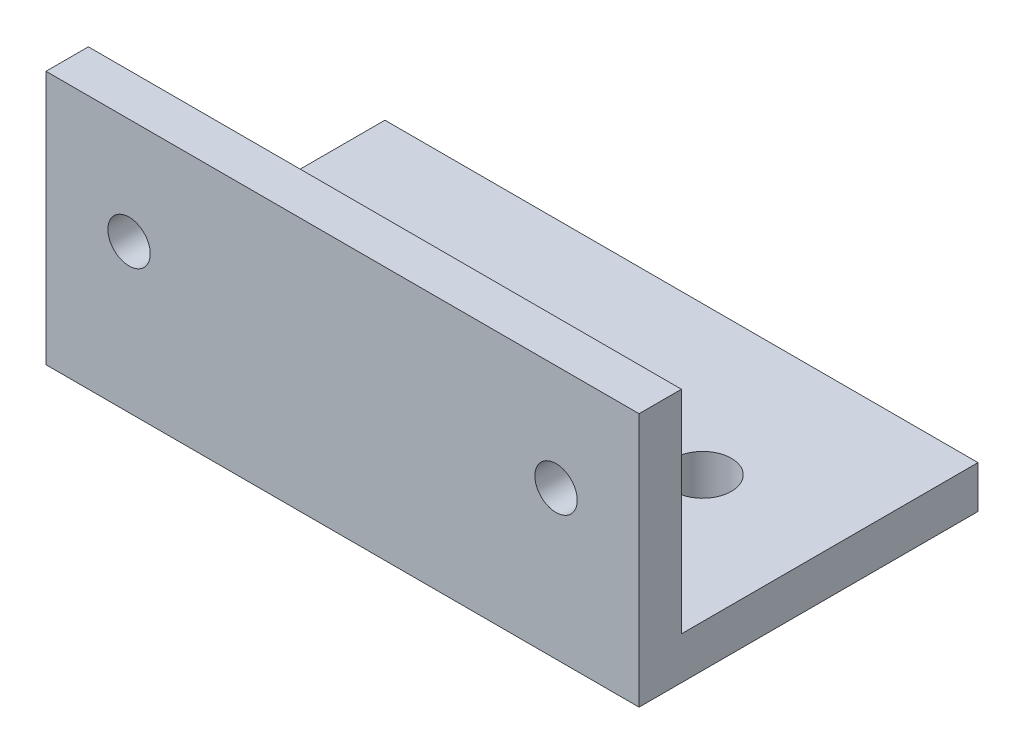
ISO-10303-21;
HEADER;
FILE_DESCRIPTION(('STEP AP214'),'2;1');
FILE_NAME('part.step','',(''),(''),'','','');
FILE_SCHEMA(('AUTOMOTIVE_DESIGN { 1 0 10303 214 1 1 1 1 }'));
ENDSEC;
DATA;
#1=APPLICATION_CONTEXT('core data for automotive mechanical design processes');
#2=APPLICATION_PROTOCOL_DEFINITION('international standard','automotive_design',2000,#1);
#3=PRODUCT_CONTEXT('',#1,'mechanical');
#4=PRODUCT('Part','Part','',(#3));
#5=PRODUCT_RELATED_PRODUCT_CATEGORY('part','',(#4));
#6=PRODUCT_DEFINITION_FORMATION('','',#4);
#7=PRODUCT_DEFINITION_CONTEXT('part definition',#1,'design');
#8=PRODUCT_DEFINITION('design','',#6,#7);
#9=PRODUCT_DEFINITION_SHAPE('','',#8);
#10=(LENGTH_UNIT() NAMED_UNIT(*) SI_UNIT(.MILLI.,.METRE.));
#11=(NAMED_UNIT(*) PLANE_ANGLE_UNIT() SI_UNIT($,.RADIAN.));
#12=(NAMED_UNIT(*) SI_UNIT($,.STERADIAN.) SOLID_ANGLE_UNIT());
#13=UNCERTAINTY_MEASURE_WITH_UNIT(LENGTH_MEASURE(1.E-05),#10,'distance_accuracy_value','');
#14=(GEOMETRIC_REPRESENTATION_CONTEXT(3) GLOBAL_UNCERTAINTY_ASSIGNED_CONTEXT((#13)) GLOBAL_UNIT_ASSIGNED_CONTEXT((#10,
#11,#12)) REPRESENTATION_CONTEXT('',''));
#15=CARTESIAN_POINT('',(0.,0.,0.));
#16=DIRECTION('',(0.,0.,1.));
#17=DIRECTION('',(1.,0.,0.));
#18=AXIS2_PLACEMENT_3D('',#15,#16,#17);
#19=CARTESIAN_POINT('',(44.45,19.05,-3.175));
#20=DIRECTION('',(0.,-1.,0.));
#21=DIRECTION('',(0.,0.,-1.));
#22=AXIS2_PLACEMENT_3D('',#19,#20,#21);
#23=PLANE('',#22);
#24=DIRECTION('',(0.,0.,1.));
#25=VECTOR('',#24,1.);
#26=CARTESIAN_POINT('',(0.,19.05,-3.175));
#27=LINE('',#26,#25);
#28=CARTESIAN_POINT('',(0.,19.05,-3.175));
#29=VERTEX_POINT('',#28);
#30=CARTESIAN_POINT('',(0.,19.05,0.));
#31=VERTEX_POINT('',#30);
#32=EDGE_CURVE('E122',#29,#31,#27,.T.);
#33=ORIENTED_EDGE('',*,*,#32,.T.);
#34=DIRECTION('',(-1.,0.,0.));
#35=VECTOR('',#34,1.);
#36=CARTESIAN_POINT('',(44.45,19.05,0.));
#37=LINE('',#36,#35);
#38=CARTESIAN_POINT('',(44.45,19.05,0.));
#39=VERTEX_POINT('',#38);
#40=EDGE_CURVE('E12',#39,#31,#37,.T.);
#41=ORIENTED_EDGE('',*,*,#40,.F.);
#42=DIRECTION('',(0.,0.,1.));
#43=VECTOR('',#42,1.);
#44=CARTESIAN_POINT('',(44.45,19.05,-3.175));
#45=LINE('',#44,#43);
#46=CARTESIAN_POINT('',(44.45,19.05,-3.175));
#47=VERTEX_POINT('',#46);
#48=EDGE_CURVE('E133',#47,#39,#45,.T.);
#49=ORIENTED_EDGE('',*,*,#48,.F.);
#50=DIRECTION('',(-1.,0.,0.));
#51=VECTOR('',#50,1.);
#52=CARTESIAN_POINT('',(44.45,19.05,-3.175));
#53=LINE('',#52,#51);
#54=EDGE_CURVE('E118',#47,#29,#53,.T.);
#55=ORIENTED_EDGE('',*,*,#54,.T.);
#56=EDGE_LOOP('',(#33,#41,#49,#55));
#57=FACE_BOUND('',#56,.T.);
#58=ADVANCED_FACE('F38',(#57),#23,.F.);
#59=CARTESIAN_POINT('',(44.45,19.05,0.));
#60=DIRECTION('',(0.,0.,-1.));
#61=DIRECTION('',(0.,1.,0.));
#62=AXIS2_PLACEMENT_3D('',#59,#60,#61);
#63=PLANE('',#62);
#64=CARTESIAN_POINT('',(38.225,11.1125,0.));
#65=DIRECTION('',(0.,0.,-1.));
#66=DIRECTION('',(0.,1.,0.));
#67=AXIS2_PLACEMENT_3D('',#64,#65,#66);
#68=CIRCLE('',#67,1.5875);
#69=CARTESIAN_POINT('',(38.225,12.7,0.));
#70=VERTEX_POINT('',#69);
#71=EDGE_CURVE('E126',#70,#70,#68,.T.);
#72=ORIENTED_EDGE('',*,*,#71,.T.);
#73=EDGE_LOOP('',(#72));
#74=FACE_BOUND('',#73,.T.);
#75=CARTESIAN_POINT('',(6.225,11.1125,0.));
#76=DIRECTION('',(0.,0.,-1.));
#77=DIRECTION('',(0.,1.,0.));
#78=AXIS2_PLACEMENT_3D('',#75,#76,#77);
#79=CIRCLE('',#78,1.5875);
#80=CARTESIAN_POINT('',(6.225,12.7,0.));
#81=VERTEX_POINT('',#80);
#82=EDGE_CURVE('E269',#81,#81,#79,.T.);
#83=ORIENTED_EDGE('',*,*,#82,.T.);
#84=EDGE_LOOP('',(#83));
#85=FACE_BOUND('',#84,.T.);
#86=DIRECTION('',(0.,-1.,0.));
#87=VECTOR('',#86,1.);
#88=CARTESIAN_POINT('',(0.,19.05,0.));
#89=LINE('',#88,#87);
#90=CARTESIAN_POINT('',(0.,0.,0.));
#91=VERTEX_POINT('',#90);
#92=EDGE_CURVE('E125',#31,#91,#89,.T.);
#93=ORIENTED_EDGE('',*,*,#92,.T.);
#94=DIRECTION('',(-1.,0.,0.));
#95=VECTOR('',#94,1.);
#96=CARTESIAN_POINT('',(44.45,0.,0.));
#97=LINE('',#96,#95);
#98=CARTESIAN_POINT('',(44.45,0.,0.));
#99=VERTEX_POINT('',#98);
#100=EDGE_CURVE('E46',#99,#91,#97,.T.);
#101=ORIENTED_EDGE('',*,*,#100,.F.);
#102=DIRECTION('',(0.,-1.,0.));
#103=VECTOR('',#102,1.);
#104=CARTESIAN_POINT('',(44.45,19.05,0.));
#105=LINE('',#104,#103);
#106=EDGE_CURVE('E91',#39,#99,#105,.T.);
#107=ORIENTED_EDGE('',*,*,#106,.F.);
#108=ORIENTED_EDGE('',*,*,#40,.T.);
#109=EDGE_LOOP('',(#93,#101,#107,#108));
#110=FACE_BOUND('',#109,.T.);
#111=ADVANCED_FACE('F161',(#74,#85,#110),#63,.F.);
#112=CARTESIAN_POINT('',(44.45,0.,0.));
#113=DIRECTION('',(0.,1.,0.));
#114=DIRECTION('',(0.,0.,1.));
#115=AXIS2_PLACEMENT_3D('',#112,#113,#114);
#116=PLANE('',#115);
#117=CARTESIAN_POINT('',(34.925,0.,-14.2875));
#118=DIRECTION('',(0.,1.,0.));
#119=DIRECTION('',(0.,0.,1.));
#120=AXIS2_PLACEMENT_3D('',#117,#118,#119);
#121=CIRCLE('',#120,2.15265);
#122=CARTESIAN_POINT('',(34.925,0.,-12.13485));
#123=VERTEX_POINT('',#122);
#124=EDGE_CURVE('E278',#123,#123,#121,.T.);
#125=ORIENTED_EDGE('',*,*,#124,.T.);
#126=EDGE_LOOP('',(#125));
#127=FACE_BOUND('',#126,.T.);
#128=CARTESIAN_POINT('',(9.52500000000001,0.,-14.2875));
#129=DIRECTION('',(0.,1.,0.));
#130=DIRECTION('',(0.,0.,1.));
#131=AXIS2_PLACEMENT_3D('',#128,#129,#130);
#132=CIRCLE('',#131,2.15265);
#133=CARTESIAN_POINT('',(9.52500000000001,0.,-12.13485));
#134=VERTEX_POINT('',#133);
#135=EDGE_CURVE('E282',#134,#134,#132,.T.);
#136=ORIENTED_EDGE('',*,*,#135,.T.);
#137=EDGE_LOOP('',(#136));
#138=FACE_BOUND('',#137,.T.);
#139=DIRECTION('',(0.,0.,-1.));
#140=VECTOR('',#139,1.);
#141=CARTESIAN_POINT('',(0.,0.,0.));
#142=LINE('',#141,#140);
#143=CARTESIAN_POINT('',(0.,0.,-25.4));
#144=VERTEX_POINT('',#143);
#145=EDGE_CURVE('E128',#91,#144,#142,.T.);
#146=ORIENTED_EDGE('',*,*,#145,.T.);
#147=DIRECTION('',(-1.,0.,0.));
#148=VECTOR('',#147,1.);
#149=CARTESIAN_POINT('',(44.45,0.,-25.4));
#150=LINE('',#149,#148);
#151=CARTESIAN_POINT('',(44.45,0.,-25.4));
#152=VERTEX_POINT('',#151);
#153=EDGE_CURVE('E113',#152,#144,#150,.T.);
#154=ORIENTED_EDGE('',*,*,#153,.F.);
#155=DIRECTION('',(0.,0.,-1.));
#156=VECTOR('',#155,1.);
#157=CARTESIAN_POINT('',(44.45,0.,0.));
#158=LINE('',#157,#156);
#159=EDGE_CURVE('E104',#99,#152,#158,.T.);
#160=ORIENTED_EDGE('',*,*,#159,.F.);
#161=ORIENTED_EDGE('',*,*,#100,.T.);
#162=EDGE_LOOP('',(#146,#154,#160,#161));
#163=FACE_BOUND('',#162,.T.);
#164=ADVANCED_FACE('F139',(#127,#138,#163),#116,.F.);
#165=CARTESIAN_POINT('',(44.45,0.,-25.4));
#166=DIRECTION('',(0.,0.,1.));
#167=DIRECTION('',(1.,0.,0.));
#168=AXIS2_PLACEMENT_3D('',#165,#166,#167);
#169=PLANE('',#168);
#170=DIRECTION('',(0.,1.,0.));
#171=VECTOR('',#170,1.);
#172=CARTESIAN_POINT('',(0.,0.,-25.4));
#173=LINE('',#172,#171);
#174=CARTESIAN_POINT('',(0.,3.175,-25.4));
#175=VERTEX_POINT('',#174);
#176=EDGE_CURVE('E112',#144,#175,#173,.T.);
#177=ORIENTED_EDGE('',*,*,#176,.T.);
#178=DIRECTION('',(-1.,0.,0.));
#179=VECTOR('',#178,1.);
#180=CARTESIAN_POINT('',(44.45,3.175,-25.4));
#181=LINE('',#180,#179);
#182=CARTESIAN_POINT('',(44.45,3.175,-25.4));
#183=VERTEX_POINT('',#182);
#184=EDGE_CURVE('E109',#183,#175,#181,.T.);
#185=ORIENTED_EDGE('',*,*,#184,.F.);
#186=DIRECTION('',(0.,1.,0.));
#187=VECTOR('',#186,1.);
#188=CARTESIAN_POINT('',(44.45,0.,-25.4));
#189=LINE('',#188,#187);
#190=EDGE_CURVE('E98',#152,#183,#189,.T.);
#191=ORIENTED_EDGE('',*,*,#190,.F.);
#192=ORIENTED_EDGE('',*,*,#153,.T.);
#193=EDGE_LOOP('',(#177,#185,#191,#192));
#194=FACE_BOUND('',#193,.T.);
#195=ADVANCED_FACE('F110',(#194),#169,.F.);
#196=CARTESIAN_POINT('',(44.45,3.175,-25.4));
#197=DIRECTION('',(0.,-1.,0.));
#198=DIRECTION('',(0.,0.,-1.));
#199=AXIS2_PLACEMENT_3D('',#196,#197,#198);
#200=PLANE('',#199);
#201=CARTESIAN_POINT('',(34.925,3.175,-14.2875));
#202=DIRECTION('',(0.,1.,0.));
#203=DIRECTION('',(0.,0.,1.));
#204=AXIS2_PLACEMENT_3D('',#201,#202,#203);
#205=CIRCLE('',#204,2.15265);
#206=CARTESIAN_POINT('',(34.925,3.175,-12.13485));
#207=VERTEX_POINT('',#206);
#208=EDGE_CURVE('E285',#207,#207,#205,.T.);
#209=ORIENTED_EDGE('',*,*,#208,.F.);
#210=EDGE_LOOP('',(#209));
#211=FACE_BOUND('',#210,.T.);
#212=CARTESIAN_POINT('',(9.52500000000001,3.175,-14.2875));
#213=DIRECTION('',(0.,1.,0.));
#214=DIRECTION('',(0.,0.,1.));
#215=AXIS2_PLACEMENT_3D('',#212,#213,#214);
#216=CIRCLE('',#215,2.15265);
#217=CARTESIAN_POINT('',(9.52500000000001,3.175,-12.13485));
#218=VERTEX_POINT('',#217);
#219=EDGE_CURVE('E286',#218,#218,#216,.T.);
#220=ORIENTED_EDGE('',*,*,#219,.F.);
#221=EDGE_LOOP('',(#220));
#222=FACE_BOUND('',#221,.T.);
#223=DIRECTION('',(0.,0.,1.));
#224=VECTOR('',#223,1.);
#225=CARTESIAN_POINT('',(0.,3.175,-25.4));
#226=LINE('',#225,#224);
#227=CARTESIAN_POINT('',(0.,3.17499999999999,-3.175));
#228=VERTEX_POINT('',#227);
#229=EDGE_CURVE('E77',#175,#228,#226,.T.);
#230=ORIENTED_EDGE('',*,*,#229,.T.);
#231=DIRECTION('',(-1.,0.,0.));
#232=VECTOR('',#231,1.);
#233=CARTESIAN_POINT('',(44.45,3.17499999999999,-3.175));
#234=LINE('',#233,#232);
#235=CARTESIAN_POINT('',(44.45,3.17499999999999,-3.175));
#236=VERTEX_POINT('',#235);
#237=EDGE_CURVE('E114',#236,#228,#234,.T.);
#238=ORIENTED_EDGE('',*,*,#237,.F.);
#239=DIRECTION('',(0.,0.,1.));
#240=VECTOR('',#239,1.);
#241=CARTESIAN_POINT('',(44.45,3.175,-25.4));
#242=LINE('',#241,#240);
#243=EDGE_CURVE('E102',#183,#236,#242,.T.);
#244=ORIENTED_EDGE('',*,*,#243,.F.);
#245=ORIENTED_EDGE('',*,*,#184,.T.);
#246=EDGE_LOOP('',(#230,#238,#244,#245));
#247=FACE_BOUND('',#246,.T.);
#248=ADVANCED_FACE('F116',(#211,#222,#247),#200,.F.);
#249=CARTESIAN_POINT('',(44.45,3.17499999999999,-3.175));
#250=DIRECTION('',(0.,0.,1.));
#251=DIRECTION('',(0.,-1.,0.));
#252=AXIS2_PLACEMENT_3D('',#249,#250,#251);
#253=PLANE('',#252);
#254=CARTESIAN_POINT('',(38.225,11.1125,-3.175));
#255=DIRECTION('',(0.,0.,-1.));
#256=DIRECTION('',(0.,1.,0.));
#257=AXIS2_PLACEMENT_3D('',#254,#255,#256);
#258=CIRCLE('',#257,1.5875);
#259=CARTESIAN_POINT('',(38.225,12.7,-3.175));
#260=VERTEX_POINT('',#259);
#261=EDGE_CURVE('E270',#260,#260,#258,.T.);
#262=ORIENTED_EDGE('',*,*,#261,.F.);
#263=EDGE_LOOP('',(#262));
#264=FACE_BOUND('',#263,.T.);
#265=CARTESIAN_POINT('',(6.225,11.1125,-3.175));
#266=DIRECTION('',(0.,0.,-1.));
#267=DIRECTION('',(0.,1.,0.));
#268=AXIS2_PLACEMENT_3D('',#265,#266,#267);
#269=CIRCLE('',#268,1.5875);
#270=CARTESIAN_POINT('',(6.225,12.7,-3.175));
#271=VERTEX_POINT('',#270);
#272=EDGE_CURVE('E266',#271,#271,#269,.T.);
#273=ORIENTED_EDGE('',*,*,#272,.F.);
#274=EDGE_LOOP('',(#273));
#275=FACE_BOUND('',#274,.T.);
#276=DIRECTION('',(0.,1.,0.));
#277=VECTOR('',#276,1.);
#278=CARTESIAN_POINT('',(0.,3.17499999999999,-3.175));
#279=LINE('',#278,#277);
#280=EDGE_CURVE('E83',#228,#29,#279,.T.);
#281=ORIENTED_EDGE('',*,*,#280,.T.);
#282=ORIENTED_EDGE('',*,*,#54,.F.);
#283=DIRECTION('',(0.,1.,0.));
#284=VECTOR('',#283,1.);
#285=CARTESIAN_POINT('',(44.45,3.17499999999999,-3.175));
#286=LINE('',#285,#284);
#287=EDGE_CURVE('E54',#236,#47,#286,.T.);
#288=ORIENTED_EDGE('',*,*,#287,.F.);
#289=ORIENTED_EDGE('',*,*,#237,.T.);
#290=EDGE_LOOP('',(#281,#282,#288,#289));
#291=FACE_BOUND('',#290,.T.);
#292=ADVANCED_FACE('F146',(#264,#275,#291),#253,.F.);
#293=CARTESIAN_POINT('',(44.45,0.,0.));
#294=DIRECTION('',(1.,0.,0.));
#295=DIRECTION('',(0.,0.,-1.));
#296=AXIS2_PLACEMENT_3D('',#293,#294,#295);
#297=PLANE('',#296);
#298=ORIENTED_EDGE('',*,*,#48,.T.);
#299=ORIENTED_EDGE('',*,*,#106,.T.);
#300=ORIENTED_EDGE('',*,*,#159,.T.);
#301=ORIENTED_EDGE('',*,*,#190,.T.);
#302=ORIENTED_EDGE('',*,*,#243,.T.);
#303=ORIENTED_EDGE('',*,*,#287,.T.);
#304=EDGE_LOOP('',(#298,#299,#300,#301,#302,#303));
#305=FACE_BOUND('',#304,.T.);
#306=ADVANCED_FACE('F100',(#305),#297,.T.);
#307=CARTESIAN_POINT('',(0.,0.,0.));
#308=DIRECTION('',(1.,0.,0.));
#309=DIRECTION('',(0.,0.,-1.));
#310=AXIS2_PLACEMENT_3D('',#307,#308,#309);
#311=PLANE('',#310);
#312=ORIENTED_EDGE('',*,*,#32,.F.);
#313=ORIENTED_EDGE('',*,*,#280,.F.);
#314=ORIENTED_EDGE('',*,*,#229,.F.);
#315=ORIENTED_EDGE('',*,*,#176,.F.);
#316=ORIENTED_EDGE('',*,*,#145,.F.);
#317=ORIENTED_EDGE('',*,*,#92,.F.);
#318=EDGE_LOOP('',(#312,#313,#314,#315,#316,#317));
#319=FACE_BOUND('',#318,.T.);
#320=ADVANCED_FACE('F142',(#319),#311,.F.);
#321=CARTESIAN_POINT('',(6.225,11.1125,22.225));
#322=DIRECTION('',(0.,0.,-1.));
#323=DIRECTION('',(0.,1.,0.));
#324=AXIS2_PLACEMENT_3D('',#321,#322,#323);
#325=CYLINDRICAL_SURFACE('',#324,1.5875);
#326=ORIENTED_EDGE('',*,*,#272,.T.);
#327=EDGE_LOOP('',(#326));
#328=FACE_BOUND('',#327,.T.);
#329=ORIENTED_EDGE('',*,*,#82,.F.);
#330=EDGE_LOOP('',(#329));
#331=FACE_BOUND('',#330,.T.);
#332=ADVANCED_FACE('F222',(#328,#331),#325,.F.);
#333=CARTESIAN_POINT('',(38.225,11.1125,22.225));
#334=DIRECTION('',(0.,0.,-1.));
#335=DIRECTION('',(0.,1.,0.));
#336=AXIS2_PLACEMENT_3D('',#333,#334,#335);
#337=CYLINDRICAL_SURFACE('',#336,1.5875);
#338=ORIENTED_EDGE('',*,*,#261,.T.);
#339=EDGE_LOOP('',(#338));
#340=FACE_BOUND('',#339,.T.);
#341=ORIENTED_EDGE('',*,*,#71,.F.);
#342=EDGE_LOOP('',(#341));
#343=FACE_BOUND('',#342,.T.);
#344=ADVANCED_FACE('F199',(#340,#343),#337,.F.);
#345=CARTESIAN_POINT('',(9.52500000000001,-22.225,-14.2875));
#346=DIRECTION('',(0.,1.,0.));
#347=DIRECTION('',(0.,0.,1.));
#348=AXIS2_PLACEMENT_3D('',#345,#346,#347);
#349=CYLINDRICAL_SURFACE('',#348,2.15265);
#350=ORIENTED_EDGE('',*,*,#219,.T.);
#351=EDGE_LOOP('',(#350));
#352=FACE_BOUND('',#351,.T.);
#353=ORIENTED_EDGE('',*,*,#135,.F.);
#354=EDGE_LOOP('',(#353));
#355=FACE_BOUND('',#354,.T.);
#356=ADVANCED_FACE('F193',(#352,#355),#349,.F.);
#357=CARTESIAN_POINT('',(34.925,-22.225,-14.2875));
#358=DIRECTION('',(0.,1.,0.));
#359=DIRECTION('',(0.,0.,1.));
#360=AXIS2_PLACEMENT_3D('',#357,#358,#359);
#361=CYLINDRICAL_SURFACE('',#360,2.15265);
#362=ORIENTED_EDGE('',*,*,#208,.T.);
#363=EDGE_LOOP('',(#362));
#364=FACE_BOUND('',#363,.T.);
#365=ORIENTED_EDGE('',*,*,#124,.F.);
#366=EDGE_LOOP('',(#365));
#367=FACE_BOUND('',#366,.T.);
#368=ADVANCED_FACE('F198',(#364,#367),#361,.F.);
#369=CLOSED_SHELL('',(#58,#111,#164,#195,#248,#292,#306,#320,#332,#344,#356,#368));
#370=MANIFOLD_SOLID_BREP('B2',#369);
#371=ADVANCED_BREP_SHAPE_REPRESENTATION('',(#18,#370),#14);
#372=SHAPE_DEFINITION_REPRESENTATION(#9,#371);
ENDSEC;
END-ISO-10303-21;
